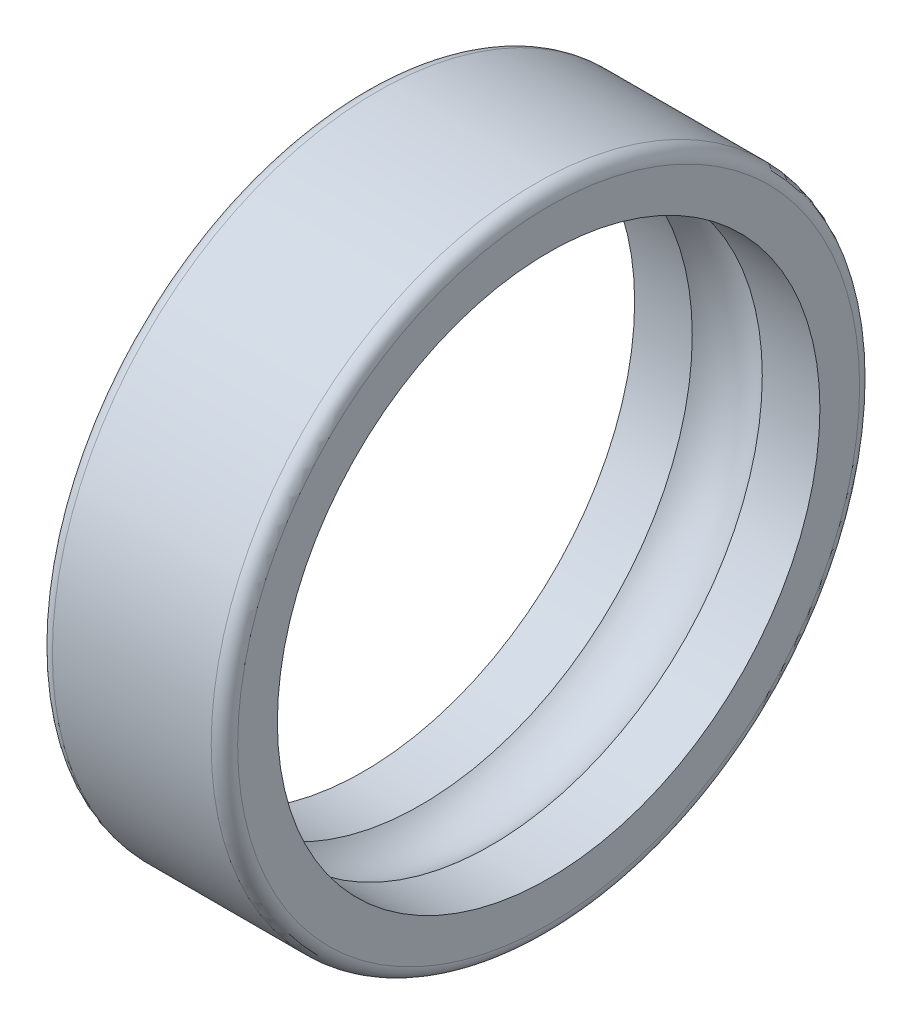
ISO-10303-21;
HEADER;
FILE_DESCRIPTION(('STEP AP214'),'2;1');
FILE_NAME('part.step','',(''),(''),'','','');
FILE_SCHEMA(('AUTOMOTIVE_DESIGN { 1 0 10303 214 1 1 1 1 }'));
ENDSEC;
DATA;
#1=APPLICATION_CONTEXT('core data for automotive mechanical design processes');
#2=APPLICATION_PROTOCOL_DEFINITION('international standard','automotive_design',2000,#1);
#3=PRODUCT_CONTEXT('',#1,'mechanical');
#4=PRODUCT('Part','Part','',(#3));
#5=PRODUCT_RELATED_PRODUCT_CATEGORY('part','',(#4));
#6=PRODUCT_DEFINITION_FORMATION('','',#4);
#7=PRODUCT_DEFINITION_CONTEXT('part definition',#1,'design');
#8=PRODUCT_DEFINITION('design','',#6,#7);
#9=PRODUCT_DEFINITION_SHAPE('','',#8);
#10=(LENGTH_UNIT() NAMED_UNIT(*) SI_UNIT(.MILLI.,.METRE.));
#11=(NAMED_UNIT(*) PLANE_ANGLE_UNIT() SI_UNIT($,.RADIAN.));
#12=(NAMED_UNIT(*) SI_UNIT($,.STERADIAN.) SOLID_ANGLE_UNIT());
#13=UNCERTAINTY_MEASURE_WITH_UNIT(LENGTH_MEASURE(1.E-05),#10,'distance_accuracy_value','');
#14=(GEOMETRIC_REPRESENTATION_CONTEXT(3) GLOBAL_UNCERTAINTY_ASSIGNED_CONTEXT((#13)) GLOBAL_UNIT_ASSIGNED_CONTEXT((#10,
#11,#12)) REPRESENTATION_CONTEXT('',''));
#15=CARTESIAN_POINT('',(0.,0.,0.));
#16=DIRECTION('',(0.,0.,1.));
#17=DIRECTION('',(1.,0.,0.));
#18=AXIS2_PLACEMENT_3D('',#15,#16,#17);
#19=CARTESIAN_POINT('',(0.,0.,0.));
#20=DIRECTION('',(-1.,0.,0.));
#21=DIRECTION('',(0.,0.,1.));
#22=AXIS2_PLACEMENT_3D('',#19,#20,#21);
#23=CYLINDRICAL_SURFACE('',#22,14.6428571428571);
#24=CARTESIAN_POINT('',(5.,0.,0.));
#25=DIRECTION('',(-1.,0.,0.));
#26=DIRECTION('',(0.,0.,1.));
#27=AXIS2_PLACEMENT_3D('',#24,#25,#26);
#28=CIRCLE('',#27,14.6428571428571);
#29=CARTESIAN_POINT('',(5.,0.,14.6428571428571));
#30=VERTEX_POINT('',#29);
#31=EDGE_CURVE('E376',#30,#30,#28,.T.);
#32=ORIENTED_EDGE('',*,*,#31,.F.);
#33=EDGE_LOOP('',(#32));
#34=FACE_BOUND('',#33,.T.);
#35=CARTESIAN_POINT('',(1.88982236504613,0.,0.));
#36=DIRECTION('',(-1.,0.,0.));
#37=DIRECTION('',(0.,0.,1.));
#38=AXIS2_PLACEMENT_3D('',#35,#36,#37);
#39=CIRCLE('',#38,14.6428571428571);
#40=CARTESIAN_POINT('',(1.88982236504613,0.,14.6428571428571));
#41=VERTEX_POINT('',#40);
#42=EDGE_CURVE('E10',#41,#41,#39,.T.);
#43=ORIENTED_EDGE('',*,*,#42,.T.);
#44=EDGE_LOOP('',(#43));
#45=FACE_BOUND('',#44,.T.);
#46=ADVANCED_FACE('F348',(#34,#45),#23,.F.);
#47=CARTESIAN_POINT('',(0.,0.,0.));
#48=DIRECTION('',(-1.,0.,0.));
#49=DIRECTION('',(0.,0.,1.));
#50=AXIS2_PLACEMENT_3D('',#47,#48,#49);
#51=TOROIDAL_SURFACE('',#50,12.5,2.85714285714286);
#52=ORIENTED_EDGE('',*,*,#42,.F.);
#53=EDGE_LOOP('',(#52));
#54=FACE_BOUND('',#53,.T.);
#55=CARTESIAN_POINT('',(-1.88982236504613,0.,0.));
#56=DIRECTION('',(-1.,0.,0.));
#57=DIRECTION('',(0.,0.,1.));
#58=AXIS2_PLACEMENT_3D('',#55,#56,#57);
#59=CIRCLE('',#58,14.6428571428571);
#60=CARTESIAN_POINT('',(-1.88982236504613,0.,14.6428571428571));
#61=VERTEX_POINT('',#60);
#62=EDGE_CURVE('E354',#61,#61,#59,.T.);
#63=ORIENTED_EDGE('',*,*,#62,.T.);
#64=EDGE_LOOP('',(#63));
#65=FACE_BOUND('',#64,.T.);
#66=ADVANCED_FACE('F383',(#54,#65),#51,.F.);
#67=CARTESIAN_POINT('',(0.,0.,0.));
#68=DIRECTION('',(-1.,0.,0.));
#69=DIRECTION('',(0.,0.,1.));
#70=AXIS2_PLACEMENT_3D('',#67,#68,#69);
#71=CYLINDRICAL_SURFACE('',#70,14.6428571428571);
#72=ORIENTED_EDGE('',*,*,#62,.F.);
#73=EDGE_LOOP('',(#72));
#74=FACE_BOUND('',#73,.T.);
#75=CARTESIAN_POINT('',(-5.,0.,0.));
#76=DIRECTION('',(-1.,0.,0.));
#77=DIRECTION('',(0.,0.,1.));
#78=AXIS2_PLACEMENT_3D('',#75,#76,#77);
#79=CIRCLE('',#78,14.6428571428571);
#80=CARTESIAN_POINT('',(-5.,0.,14.6428571428571));
#81=VERTEX_POINT('',#80);
#82=EDGE_CURVE('E358',#81,#81,#79,.T.);
#83=ORIENTED_EDGE('',*,*,#82,.T.);
#84=EDGE_LOOP('',(#83));
#85=FACE_BOUND('',#84,.T.);
#86=ADVANCED_FACE('F387',(#74,#85),#71,.F.);
#87=CARTESIAN_POINT('',(-5.,16.7857142857143,0.));
#88=DIRECTION('',(1.,0.,0.));
#89=DIRECTION('',(0.,0.,-1.));
#90=AXIS2_PLACEMENT_3D('',#87,#88,#89);
#91=PLANE('',#90);
#92=ORIENTED_EDGE('',*,*,#82,.F.);
#93=EDGE_LOOP('',(#92));
#94=FACE_BOUND('',#93,.T.);
#95=CARTESIAN_POINT('',(-5.,0.,0.));
#96=DIRECTION('',(-1.,0.,0.));
#97=DIRECTION('',(0.,0.,1.));
#98=AXIS2_PLACEMENT_3D('',#95,#96,#97);
#99=CIRCLE('',#98,16.7857142857143);
#100=CARTESIAN_POINT('',(-5.,0.,16.7857142857143));
#101=VERTEX_POINT('',#100);
#102=EDGE_CURVE('E362',#101,#101,#99,.T.);
#103=ORIENTED_EDGE('',*,*,#102,.T.);
#104=EDGE_LOOP('',(#103));
#105=FACE_BOUND('',#104,.T.);
#106=ADVANCED_FACE('F392',(#94,#105),#91,.F.);
#107=CARTESIAN_POINT('',(-4.28571428571429,0.,0.));
#108=DIRECTION('',(-1.,0.,0.));
#109=DIRECTION('',(0.,0.,1.));
#110=AXIS2_PLACEMENT_3D('',#107,#108,#109);
#111=TOROIDAL_SURFACE('',#110,16.7857142857143,0.714285714285715);
#112=ORIENTED_EDGE('',*,*,#102,.F.);
#113=EDGE_LOOP('',(#112));
#114=FACE_BOUND('',#113,.T.);
#115=CARTESIAN_POINT('',(-4.28571428571429,0.,0.));
#116=DIRECTION('',(-1.,0.,0.));
#117=DIRECTION('',(0.,0.,1.));
#118=AXIS2_PLACEMENT_3D('',#115,#116,#117);
#119=CIRCLE('',#118,17.5);
#120=CARTESIAN_POINT('',(-4.28571428571429,0.,17.5));
#121=VERTEX_POINT('',#120);
#122=EDGE_CURVE('E367',#121,#121,#119,.T.);
#123=ORIENTED_EDGE('',*,*,#122,.T.);
#124=EDGE_LOOP('',(#123));
#125=FACE_BOUND('',#124,.T.);
#126=ADVANCED_FACE('F398',(#114,#125),#111,.T.);
#127=CARTESIAN_POINT('',(0.,0.,0.));
#128=DIRECTION('',(-1.,0.,0.));
#129=DIRECTION('',(0.,0.,1.));
#130=AXIS2_PLACEMENT_3D('',#127,#128,#129);
#131=CYLINDRICAL_SURFACE('',#130,17.5);
#132=ORIENTED_EDGE('',*,*,#122,.F.);
#133=EDGE_LOOP('',(#132));
#134=FACE_BOUND('',#133,.T.);
#135=CARTESIAN_POINT('',(4.28571428571429,0.,0.));
#136=DIRECTION('',(-1.,0.,0.));
#137=DIRECTION('',(0.,0.,1.));
#138=AXIS2_PLACEMENT_3D('',#135,#136,#137);
#139=CIRCLE('',#138,17.5);
#140=CARTESIAN_POINT('',(4.28571428571429,0.,17.5));
#141=VERTEX_POINT('',#140);
#142=EDGE_CURVE('E370',#141,#141,#139,.T.);
#143=ORIENTED_EDGE('',*,*,#142,.T.);
#144=EDGE_LOOP('',(#143));
#145=FACE_BOUND('',#144,.T.);
#146=ADVANCED_FACE('F402',(#134,#145),#131,.T.);
#147=CARTESIAN_POINT('',(4.28571428571429,0.,0.));
#148=DIRECTION('',(-1.,0.,0.));
#149=DIRECTION('',(0.,0.,1.));
#150=AXIS2_PLACEMENT_3D('',#147,#148,#149);
#151=TOROIDAL_SURFACE('',#150,16.7857142857143,0.714285714285715);
#152=ORIENTED_EDGE('',*,*,#142,.F.);
#153=EDGE_LOOP('',(#152));
#154=FACE_BOUND('',#153,.T.);
#155=CARTESIAN_POINT('',(5.,0.,0.));
#156=DIRECTION('',(-1.,0.,0.));
#157=DIRECTION('',(0.,0.,1.));
#158=AXIS2_PLACEMENT_3D('',#155,#156,#157);
#159=CIRCLE('',#158,16.7857142857143);
#160=CARTESIAN_POINT('',(5.,0.,16.7857142857143));
#161=VERTEX_POINT('',#160);
#162=EDGE_CURVE('E373',#161,#161,#159,.T.);
#163=ORIENTED_EDGE('',*,*,#162,.T.);
#164=EDGE_LOOP('',(#163));
#165=FACE_BOUND('',#164,.T.);
#166=ADVANCED_FACE('F406',(#154,#165),#151,.T.);
#167=CARTESIAN_POINT('',(5.,16.7857142857143,0.));
#168=DIRECTION('',(-1.,0.,0.));
#169=DIRECTION('',(0.,0.,1.));
#170=AXIS2_PLACEMENT_3D('',#167,#168,#169);
#171=PLANE('',#170);
#172=ORIENTED_EDGE('',*,*,#162,.F.);
#173=EDGE_LOOP('',(#172));
#174=FACE_BOUND('',#173,.T.);
#175=ORIENTED_EDGE('',*,*,#31,.T.);
#176=EDGE_LOOP('',(#175));
#177=FACE_BOUND('',#176,.T.);
#178=ADVANCED_FACE('F380',(#174,#177),#171,.F.);
#179=CLOSED_SHELL('',(#46,#66,#86,#106,#126,#146,#166,#178));
#180=MANIFOLD_SOLID_BREP('B2',#179);
#181=ADVANCED_BREP_SHAPE_REPRESENTATION('',(#18,#180),#14);
#182=SHAPE_DEFINITION_REPRESENTATION(#9,#181);
ENDSEC;
END-ISO-10303-21;
